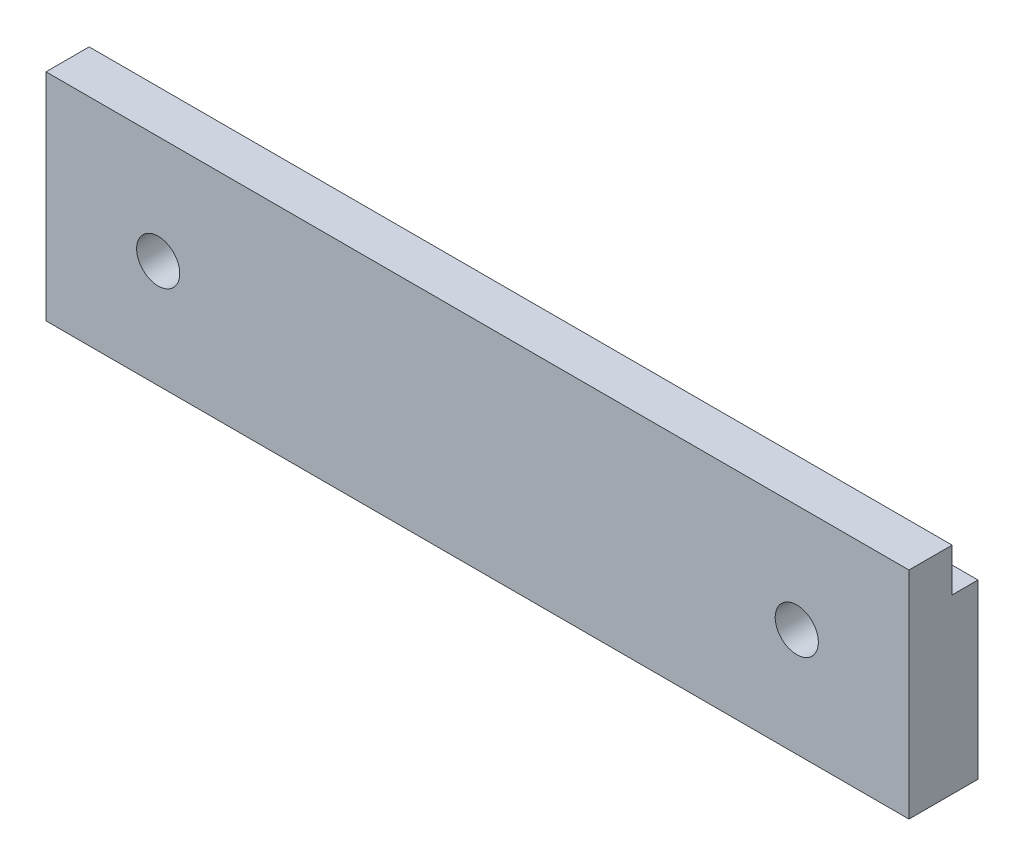
ISO-10303-21;
HEADER;
FILE_DESCRIPTION(('STEP AP214'),'2;1');
FILE_NAME('part.step','',(''),(''),'','','');
FILE_SCHEMA(('AUTOMOTIVE_DESIGN { 1 0 10303 214 1 1 1 1 }'));
ENDSEC;
DATA;
#1=APPLICATION_CONTEXT('core data for automotive mechanical design processes');
#2=APPLICATION_PROTOCOL_DEFINITION('international standard','automotive_design',2000,#1);
#3=PRODUCT_CONTEXT('',#1,'mechanical');
#4=PRODUCT('Part','Part','',(#3));
#5=PRODUCT_RELATED_PRODUCT_CATEGORY('part','',(#4));
#6=PRODUCT_DEFINITION_FORMATION('','',#4);
#7=PRODUCT_DEFINITION_CONTEXT('part definition',#1,'design');
#8=PRODUCT_DEFINITION('design','',#6,#7);
#9=PRODUCT_DEFINITION_SHAPE('','',#8);
#10=(LENGTH_UNIT() NAMED_UNIT(*) SI_UNIT(.MILLI.,.METRE.));
#11=(NAMED_UNIT(*) PLANE_ANGLE_UNIT() SI_UNIT($,.RADIAN.));
#12=(NAMED_UNIT(*) SI_UNIT($,.STERADIAN.) SOLID_ANGLE_UNIT());
#13=UNCERTAINTY_MEASURE_WITH_UNIT(LENGTH_MEASURE(1.E-05),#10,'distance_accuracy_value','');
#14=(GEOMETRIC_REPRESENTATION_CONTEXT(3) GLOBAL_UNCERTAINTY_ASSIGNED_CONTEXT((#13)) GLOBAL_UNIT_ASSIGNED_CONTEXT((#10,
#11,#12)) REPRESENTATION_CONTEXT('',''));
#15=CARTESIAN_POINT('',(0.,0.,0.));
#16=DIRECTION('',(0.,0.,1.));
#17=DIRECTION('',(1.,0.,0.));
#18=AXIS2_PLACEMENT_3D('',#15,#16,#17);
#19=CARTESIAN_POINT('',(100.,0.,-5.00000000000001));
#20=DIRECTION('',(0.,0.,-1.));
#21=DIRECTION('',(0.,1.,0.));
#22=AXIS2_PLACEMENT_3D('',#19,#20,#21);
#23=PLANE('',#22);
#24=DIRECTION('',(0.,-1.,0.));
#25=VECTOR('',#24,1.);
#26=CARTESIAN_POINT('',(0.,0.,-5.00000000000001));
#27=LINE('',#26,#25);
#28=CARTESIAN_POINT('',(0.,25.,-5.));
#29=VERTEX_POINT('',#28);
#30=CARTESIAN_POINT('',(0.,20.,-5.));
#31=VERTEX_POINT('',#30);
#32=EDGE_CURVE('E118',#29,#31,#27,.T.);
#33=ORIENTED_EDGE('',*,*,#32,.F.);
#34=DIRECTION('',(-1.,0.,0.));
#35=VECTOR('',#34,1.);
#36=CARTESIAN_POINT('',(100.,25.,-5.));
#37=LINE('',#36,#35);
#38=CARTESIAN_POINT('',(100.,25.,-5.));
#39=VERTEX_POINT('',#38);
#40=EDGE_CURVE('E11',#39,#29,#37,.T.);
#41=ORIENTED_EDGE('',*,*,#40,.F.);
#42=DIRECTION('',(0.,-1.,0.));
#43=VECTOR('',#42,1.);
#44=CARTESIAN_POINT('',(100.,0.,-5.00000000000001));
#45=LINE('',#44,#43);
#46=CARTESIAN_POINT('',(100.,20.,-5.));
#47=VERTEX_POINT('',#46);
#48=EDGE_CURVE('E132',#39,#47,#45,.T.);
#49=ORIENTED_EDGE('',*,*,#48,.T.);
#50=DIRECTION('',(-1.,0.,0.));
#51=VECTOR('',#50,1.);
#52=CARTESIAN_POINT('',(100.,20.,-5.));
#53=LINE('',#52,#51);
#54=EDGE_CURVE('E83',#47,#31,#53,.T.);
#55=ORIENTED_EDGE('',*,*,#54,.T.);
#56=EDGE_LOOP('',(#33,#41,#49,#55));
#57=FACE_BOUND('',#56,.T.);
#58=ADVANCED_FACE('F38',(#57),#23,.T.);
#59=CARTESIAN_POINT('',(100.,25.,0.));
#60=DIRECTION('',(0.,1.,0.));
#61=DIRECTION('',(0.,0.,1.));
#62=AXIS2_PLACEMENT_3D('',#59,#60,#61);
#63=PLANE('',#62);
#64=DIRECTION('',(0.,0.,-1.));
#65=VECTOR('',#64,1.);
#66=CARTESIAN_POINT('',(0.,25.,0.));
#67=LINE('',#66,#65);
#68=CARTESIAN_POINT('',(0.,25.,0.));
#69=VERTEX_POINT('',#68);
#70=EDGE_CURVE('E121',#69,#29,#67,.T.);
#71=ORIENTED_EDGE('',*,*,#70,.F.);
#72=DIRECTION('',(-1.,0.,0.));
#73=VECTOR('',#72,1.);
#74=CARTESIAN_POINT('',(100.,25.,0.));
#75=LINE('',#74,#73);
#76=CARTESIAN_POINT('',(100.,25.,0.));
#77=VERTEX_POINT('',#76);
#78=EDGE_CURVE('E46',#77,#69,#75,.T.);
#79=ORIENTED_EDGE('',*,*,#78,.F.);
#80=DIRECTION('',(0.,0.,-1.));
#81=VECTOR('',#80,1.);
#82=CARTESIAN_POINT('',(100.,25.,0.));
#83=LINE('',#82,#81);
#84=EDGE_CURVE('E147',#77,#39,#83,.T.);
#85=ORIENTED_EDGE('',*,*,#84,.T.);
#86=ORIENTED_EDGE('',*,*,#40,.T.);
#87=EDGE_LOOP('',(#71,#79,#85,#86));
#88=FACE_BOUND('',#87,.T.);
#89=ADVANCED_FACE('F141',(#88),#63,.T.);
#90=CARTESIAN_POINT('',(100.,0.,0.));
#91=DIRECTION('',(0.,0.,1.));
#92=DIRECTION('',(1.,0.,0.));
#93=AXIS2_PLACEMENT_3D('',#90,#91,#92);
#94=PLANE('',#93);
#95=CARTESIAN_POINT('',(87.,12.5,0.));
#96=DIRECTION('',(0.,0.,1.));
#97=DIRECTION('',(1.,0.,0.));
#98=AXIS2_PLACEMENT_3D('',#95,#96,#97);
#99=CIRCLE('',#98,2.5);
#100=CARTESIAN_POINT('',(89.5,12.5,0.));
#101=VERTEX_POINT('',#100);
#102=EDGE_CURVE('E159',#101,#101,#99,.T.);
#103=ORIENTED_EDGE('',*,*,#102,.F.);
#104=EDGE_LOOP('',(#103));
#105=FACE_BOUND('',#104,.T.);
#106=CARTESIAN_POINT('',(13.,12.5,0.));
#107=DIRECTION('',(0.,0.,1.));
#108=DIRECTION('',(1.,0.,0.));
#109=AXIS2_PLACEMENT_3D('',#106,#107,#108);
#110=CIRCLE('',#109,2.5);
#111=CARTESIAN_POINT('',(15.5,12.5,0.));
#112=VERTEX_POINT('',#111);
#113=EDGE_CURVE('E153',#112,#112,#110,.T.);
#114=ORIENTED_EDGE('',*,*,#113,.F.);
#115=EDGE_LOOP('',(#114));
#116=FACE_BOUND('',#115,.T.);
#117=DIRECTION('',(0.,1.,0.));
#118=VECTOR('',#117,1.);
#119=CARTESIAN_POINT('',(0.,0.,0.));
#120=LINE('',#119,#118);
#121=CARTESIAN_POINT('',(0.,0.,0.));
#122=VERTEX_POINT('',#121);
#123=EDGE_CURVE('E125',#122,#69,#120,.T.);
#124=ORIENTED_EDGE('',*,*,#123,.F.);
#125=DIRECTION('',(-1.,0.,0.));
#126=VECTOR('',#125,1.);
#127=CARTESIAN_POINT('',(100.,0.,0.));
#128=LINE('',#127,#126);
#129=CARTESIAN_POINT('',(100.,0.,0.));
#130=VERTEX_POINT('',#129);
#131=EDGE_CURVE('E110',#130,#122,#128,.T.);
#132=ORIENTED_EDGE('',*,*,#131,.F.);
#133=DIRECTION('',(0.,1.,0.));
#134=VECTOR('',#133,1.);
#135=CARTESIAN_POINT('',(100.,0.,0.));
#136=LINE('',#135,#134);
#137=EDGE_CURVE('E103',#130,#77,#136,.T.);
#138=ORIENTED_EDGE('',*,*,#137,.T.);
#139=ORIENTED_EDGE('',*,*,#78,.T.);
#140=EDGE_LOOP('',(#124,#132,#138,#139));
#141=FACE_BOUND('',#140,.T.);
#142=ADVANCED_FACE('F138',(#105,#116,#141),#94,.T.);
#143=CARTESIAN_POINT('',(100.,0.,0.));
#144=DIRECTION('',(0.,1.,0.));
#145=DIRECTION('',(0.,0.,1.));
#146=AXIS2_PLACEMENT_3D('',#143,#144,#145);
#147=PLANE('',#146);
#148=DIRECTION('',(0.,0.,-1.));
#149=VECTOR('',#148,1.);
#150=CARTESIAN_POINT('',(0.,0.,0.));
#151=LINE('',#150,#149);
#152=CARTESIAN_POINT('',(0.,0.,-8.));
#153=VERTEX_POINT('',#152);
#154=EDGE_CURVE('E109',#122,#153,#151,.T.);
#155=ORIENTED_EDGE('',*,*,#154,.T.);
#156=DIRECTION('',(-1.,0.,0.));
#157=VECTOR('',#156,1.);
#158=CARTESIAN_POINT('',(100.,0.,-8.));
#159=LINE('',#158,#157);
#160=CARTESIAN_POINT('',(100.,0.,-8.));
#161=VERTEX_POINT('',#160);
#162=EDGE_CURVE('E106',#161,#153,#159,.T.);
#163=ORIENTED_EDGE('',*,*,#162,.F.);
#164=DIRECTION('',(0.,0.,-1.));
#165=VECTOR('',#164,1.);
#166=CARTESIAN_POINT('',(100.,0.,0.));
#167=LINE('',#166,#165);
#168=EDGE_CURVE('E96',#130,#161,#167,.T.);
#169=ORIENTED_EDGE('',*,*,#168,.F.);
#170=ORIENTED_EDGE('',*,*,#131,.T.);
#171=EDGE_LOOP('',(#155,#163,#169,#170));
#172=FACE_BOUND('',#171,.T.);
#173=ADVANCED_FACE('F107',(#172),#147,.F.);
#174=CARTESIAN_POINT('',(100.,0.,-8.));
#175=DIRECTION('',(0.,0.,1.));
#176=DIRECTION('',(1.,0.,0.));
#177=AXIS2_PLACEMENT_3D('',#174,#175,#176);
#178=PLANE('',#177);
#179=CARTESIAN_POINT('',(87.,12.5,-8.));
#180=DIRECTION('',(0.,0.,1.));
#181=DIRECTION('',(1.,0.,0.));
#182=AXIS2_PLACEMENT_3D('',#179,#180,#181);
#183=CIRCLE('',#182,2.5);
#184=CARTESIAN_POINT('',(89.5,12.5,-8.));
#185=VERTEX_POINT('',#184);
#186=EDGE_CURVE('E156',#185,#185,#183,.T.);
#187=ORIENTED_EDGE('',*,*,#186,.T.);
#188=EDGE_LOOP('',(#187));
#189=FACE_BOUND('',#188,.T.);
#190=CARTESIAN_POINT('',(13.,12.5,-8.));
#191=DIRECTION('',(0.,0.,1.));
#192=DIRECTION('',(1.,0.,0.));
#193=AXIS2_PLACEMENT_3D('',#190,#191,#192);
#194=CIRCLE('',#193,2.5);
#195=CARTESIAN_POINT('',(15.5,12.5,-8.));
#196=VERTEX_POINT('',#195);
#197=EDGE_CURVE('E122',#196,#196,#194,.T.);
#198=ORIENTED_EDGE('',*,*,#197,.T.);
#199=EDGE_LOOP('',(#198));
#200=FACE_BOUND('',#199,.T.);
#201=DIRECTION('',(0.,1.,0.));
#202=VECTOR('',#201,1.);
#203=CARTESIAN_POINT('',(0.,0.,-8.));
#204=LINE('',#203,#202);
#205=CARTESIAN_POINT('',(0.,20.,-8.));
#206=VERTEX_POINT('',#205);
#207=EDGE_CURVE('E76',#153,#206,#204,.T.);
#208=ORIENTED_EDGE('',*,*,#207,.T.);
#209=DIRECTION('',(-1.,0.,0.));
#210=VECTOR('',#209,1.);
#211=CARTESIAN_POINT('',(100.,20.,-8.));
#212=LINE('',#211,#210);
#213=CARTESIAN_POINT('',(100.,20.,-8.));
#214=VERTEX_POINT('',#213);
#215=EDGE_CURVE('E111',#214,#206,#212,.T.);
#216=ORIENTED_EDGE('',*,*,#215,.F.);
#217=DIRECTION('',(0.,1.,0.));
#218=VECTOR('',#217,1.);
#219=CARTESIAN_POINT('',(100.,0.,-8.));
#220=LINE('',#219,#218);
#221=EDGE_CURVE('E100',#161,#214,#220,.T.);
#222=ORIENTED_EDGE('',*,*,#221,.F.);
#223=ORIENTED_EDGE('',*,*,#162,.T.);
#224=EDGE_LOOP('',(#208,#216,#222,#223));
#225=FACE_BOUND('',#224,.T.);
#226=ADVANCED_FACE('F113',(#189,#200,#225),#178,.F.);
#227=CARTESIAN_POINT('',(100.,20.,0.));
#228=DIRECTION('',(0.,-1.,0.));
#229=DIRECTION('',(0.,0.,-1.));
#230=AXIS2_PLACEMENT_3D('',#227,#228,#229);
#231=PLANE('',#230);
#232=DIRECTION('',(0.,0.,1.));
#233=VECTOR('',#232,1.);
#234=CARTESIAN_POINT('',(0.,20.,0.));
#235=LINE('',#234,#233);
#236=EDGE_CURVE('E130',#206,#31,#235,.T.);
#237=ORIENTED_EDGE('',*,*,#236,.T.);
#238=ORIENTED_EDGE('',*,*,#54,.F.);
#239=DIRECTION('',(0.,0.,1.));
#240=VECTOR('',#239,1.);
#241=CARTESIAN_POINT('',(100.,20.,0.));
#242=LINE('',#241,#240);
#243=EDGE_CURVE('E54',#214,#47,#242,.T.);
#244=ORIENTED_EDGE('',*,*,#243,.F.);
#245=ORIENTED_EDGE('',*,*,#215,.T.);
#246=EDGE_LOOP('',(#237,#238,#244,#245));
#247=FACE_BOUND('',#246,.T.);
#248=ADVANCED_FACE('F146',(#247),#231,.F.);
#249=CARTESIAN_POINT('',(100.,0.,0.));
#250=DIRECTION('',(1.,0.,0.));
#251=DIRECTION('',(0.,0.,-1.));
#252=AXIS2_PLACEMENT_3D('',#249,#250,#251);
#253=PLANE('',#252);
#254=ORIENTED_EDGE('',*,*,#48,.F.);
#255=ORIENTED_EDGE('',*,*,#84,.F.);
#256=ORIENTED_EDGE('',*,*,#137,.F.);
#257=ORIENTED_EDGE('',*,*,#168,.T.);
#258=ORIENTED_EDGE('',*,*,#221,.T.);
#259=ORIENTED_EDGE('',*,*,#243,.T.);
#260=EDGE_LOOP('',(#254,#255,#256,#257,#258,#259));
#261=FACE_BOUND('',#260,.T.);
#262=ADVANCED_FACE('F98',(#261),#253,.T.);
#263=CARTESIAN_POINT('',(0.,0.,0.));
#264=DIRECTION('',(1.,0.,0.));
#265=DIRECTION('',(0.,0.,-1.));
#266=AXIS2_PLACEMENT_3D('',#263,#264,#265);
#267=PLANE('',#266);
#268=ORIENTED_EDGE('',*,*,#32,.T.);
#269=ORIENTED_EDGE('',*,*,#236,.F.);
#270=ORIENTED_EDGE('',*,*,#207,.F.);
#271=ORIENTED_EDGE('',*,*,#154,.F.);
#272=ORIENTED_EDGE('',*,*,#123,.T.);
#273=ORIENTED_EDGE('',*,*,#70,.T.);
#274=EDGE_LOOP('',(#268,#269,#270,#271,#272,#273));
#275=FACE_BOUND('',#274,.T.);
#276=ADVANCED_FACE('F143',(#275),#267,.F.);
#277=CARTESIAN_POINT('',(13.,12.5,0.));
#278=DIRECTION('',(0.,0.,1.));
#279=DIRECTION('',(1.,0.,0.));
#280=AXIS2_PLACEMENT_3D('',#277,#278,#279);
#281=CYLINDRICAL_SURFACE('',#280,2.5);
#282=ORIENTED_EDGE('',*,*,#197,.F.);
#283=EDGE_LOOP('',(#282));
#284=FACE_BOUND('',#283,.T.);
#285=ORIENTED_EDGE('',*,*,#113,.T.);
#286=EDGE_LOOP('',(#285));
#287=FACE_BOUND('',#286,.T.);
#288=ADVANCED_FACE('F170',(#284,#287),#281,.F.);
#289=CARTESIAN_POINT('',(87.,12.5,0.));
#290=DIRECTION('',(0.,0.,1.));
#291=DIRECTION('',(1.,0.,0.));
#292=AXIS2_PLACEMENT_3D('',#289,#290,#291);
#293=CYLINDRICAL_SURFACE('',#292,2.5);
#294=ORIENTED_EDGE('',*,*,#186,.F.);
#295=EDGE_LOOP('',(#294));
#296=FACE_BOUND('',#295,.T.);
#297=ORIENTED_EDGE('',*,*,#102,.T.);
#298=EDGE_LOOP('',(#297));
#299=FACE_BOUND('',#298,.T.);
#300=ADVANCED_FACE('F163',(#296,#299),#293,.F.);
#301=CLOSED_SHELL('',(#58,#89,#142,#173,#226,#248,#262,#276,#288,#300));
#302=MANIFOLD_SOLID_BREP('B2',#301);
#303=ADVANCED_BREP_SHAPE_REPRESENTATION('',(#18,#302),#14);
#304=SHAPE_DEFINITION_REPRESENTATION(#9,#303);
ENDSEC;
END-ISO-10303-21;
